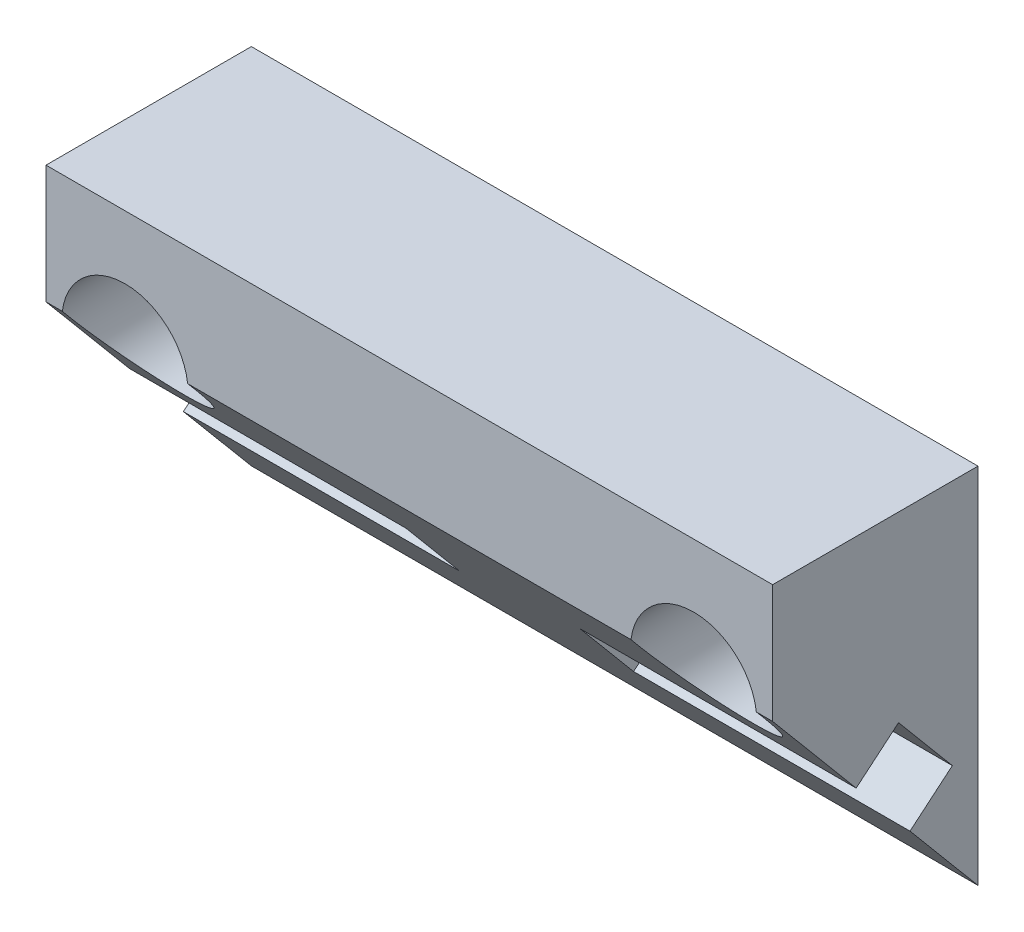
ISO-10303-21;
HEADER;
FILE_DESCRIPTION(('STEP AP214'),'2;1');
FILE_NAME('part.step','',(''),(''),'','','');
FILE_SCHEMA(('AUTOMOTIVE_DESIGN { 1 0 10303 214 1 1 1 1 }'));
ENDSEC;
DATA;
#1=APPLICATION_CONTEXT('core data for automotive mechanical design processes');
#2=APPLICATION_PROTOCOL_DEFINITION('international standard','automotive_design',2000,#1);
#3=PRODUCT_CONTEXT('',#1,'mechanical');
#4=PRODUCT('Part','Part','',(#3));
#5=PRODUCT_RELATED_PRODUCT_CATEGORY('part','',(#4));
#6=PRODUCT_DEFINITION_FORMATION('','',#4);
#7=PRODUCT_DEFINITION_CONTEXT('part definition',#1,'design');
#8=PRODUCT_DEFINITION('design','',#6,#7);
#9=PRODUCT_DEFINITION_SHAPE('','',#8);
#10=(LENGTH_UNIT() NAMED_UNIT(*) SI_UNIT(.MILLI.,.METRE.));
#11=(NAMED_UNIT(*) PLANE_ANGLE_UNIT() SI_UNIT($,.RADIAN.));
#12=(NAMED_UNIT(*) SI_UNIT($,.STERADIAN.) SOLID_ANGLE_UNIT());
#13=UNCERTAINTY_MEASURE_WITH_UNIT(LENGTH_MEASURE(1.E-05),#10,'distance_accuracy_value','');
#14=(GEOMETRIC_REPRESENTATION_CONTEXT(3) GLOBAL_UNCERTAINTY_ASSIGNED_CONTEXT((#13)) GLOBAL_UNIT_ASSIGNED_CONTEXT((#10,
#11,#12)) REPRESENTATION_CONTEXT('',''));
#15=CARTESIAN_POINT('',(0.,0.,0.));
#16=DIRECTION('',(0.,0.,1.));
#17=DIRECTION('',(1.,0.,0.));
#18=AXIS2_PLACEMENT_3D('',#15,#16,#17);
#19=CARTESIAN_POINT('',(23.,-14.9891467909166,0.));
#20=DIRECTION('',(0.,0.642787609686539,-0.766044443118978));
#21=DIRECTION('',(0.,0.766044443118978,0.642787609686539));
#22=AXIS2_PLACEMENT_3D('',#19,#20,#21);
#23=PLANE('',#22);
#24=DIRECTION('',(0.,-0.766044443118978,-0.642787609686539));
#25=VECTOR('',#24,1.);
#26=CARTESIAN_POINT('',(-23.,-14.9891467909166,0.));
#27=LINE('',#26,#25);
#28=CARTESIAN_POINT('',(-23.,0.503649912808122,13.));
#29=VERTEX_POINT('',#28);
#30=CARTESIAN_POINT('',(-23.,-5.79873444054971,7.71167161355999));
#31=VERTEX_POINT('',#30);
#32=EDGE_CURVE('E233',#29,#31,#27,.T.);
#33=ORIENTED_EDGE('',*,*,#32,.T.);
#34=DIRECTION('',(1.,0.,0.));
#35=VECTOR('',#34,1.);
#36=CARTESIAN_POINT('',(-23.,-5.79873444054971,7.71167161355999));
#37=LINE('',#36,#35);
#38=CARTESIAN_POINT('',(-5.5,-5.79873444054971,7.71167161355999));
#39=VERTEX_POINT('',#38);
#40=EDGE_CURVE('E180',#31,#39,#37,.T.);
#41=ORIENTED_EDGE('',*,*,#40,.T.);
#42=DIRECTION('',(0.,-0.766044443118978,-0.642787609686539));
#43=VECTOR('',#42,1.);
#44=CARTESIAN_POINT('',(-5.5,-9.85876998908029,4.30489728222133));
#45=LINE('',#44,#43);
#46=CARTESIAN_POINT('',(-5.5,-9.85876998908029,4.30489728222133));
#47=VERTEX_POINT('',#46);
#48=EDGE_CURVE('E161',#39,#47,#45,.T.);
#49=ORIENTED_EDGE('',*,*,#48,.T.);
#50=DIRECTION('',(1.,0.,0.));
#51=VECTOR('',#50,1.);
#52=CARTESIAN_POINT('',(-23.,-9.85876998908029,4.30489728222133));
#53=LINE('',#52,#51);
#54=CARTESIAN_POINT('',(-23.,-9.85876998908029,4.30489728222133));
#55=VERTEX_POINT('',#54);
#56=EDGE_CURVE('E172',#55,#47,#53,.T.);
#57=ORIENTED_EDGE('',*,*,#56,.F.);
#58=CARTESIAN_POINT('',(-23.,-14.9891467909166,0.));
#59=VERTEX_POINT('',#58);
#60=EDGE_CURVE('E162',#55,#59,#27,.T.);
#61=ORIENTED_EDGE('',*,*,#60,.T.);
#62=DIRECTION('',(-1.,0.,0.));
#63=VECTOR('',#62,1.);
#64=CARTESIAN_POINT('',(23.,-14.9891467909166,0.));
#65=LINE('',#64,#63);
#66=CARTESIAN_POINT('',(23.,-14.9891467909166,0.));
#67=VERTEX_POINT('',#66);
#68=EDGE_CURVE('E237',#67,#59,#65,.T.);
#69=ORIENTED_EDGE('',*,*,#68,.F.);
#70=DIRECTION('',(0.,-0.766044443118978,-0.642787609686539));
#71=VECTOR('',#70,1.);
#72=CARTESIAN_POINT('',(23.,-14.9891467909166,0.));
#73=LINE('',#72,#71);
#74=CARTESIAN_POINT('',(23.,-9.85876998908029,4.30489728222133));
#75=VERTEX_POINT('',#74);
#76=EDGE_CURVE('E232',#75,#67,#73,.T.);
#77=ORIENTED_EDGE('',*,*,#76,.F.);
#78=DIRECTION('',(-1.,0.,0.));
#79=VECTOR('',#78,1.);
#80=CARTESIAN_POINT('',(23.,-9.85876998908029,4.30489728222133));
#81=LINE('',#80,#79);
#82=CARTESIAN_POINT('',(5.5,-9.85876998908029,4.30489728222133));
#83=VERTEX_POINT('',#82);
#84=EDGE_CURVE('E189',#75,#83,#81,.T.);
#85=ORIENTED_EDGE('',*,*,#84,.T.);
#86=DIRECTION('',(0.,-0.766044443118978,-0.642787609686539));
#87=VECTOR('',#86,1.);
#88=CARTESIAN_POINT('',(5.5,-9.85876998908029,4.30489728222133));
#89=LINE('',#88,#87);
#90=CARTESIAN_POINT('',(5.5,-5.79873444054971,7.71167161355999));
#91=VERTEX_POINT('',#90);
#92=EDGE_CURVE('E183',#91,#83,#89,.T.);
#93=ORIENTED_EDGE('',*,*,#92,.F.);
#94=DIRECTION('',(-1.,0.,0.));
#95=VECTOR('',#94,1.);
#96=CARTESIAN_POINT('',(23.,-5.79873444054971,7.71167161355999));
#97=LINE('',#96,#95);
#98=CARTESIAN_POINT('',(23.,-5.79873444054971,7.71167161355999));
#99=VERTEX_POINT('',#98);
#100=EDGE_CURVE('E196',#99,#91,#97,.T.);
#101=ORIENTED_EDGE('',*,*,#100,.F.);
#102=CARTESIAN_POINT('',(23.,0.503649912808122,13.));
#103=VERTEX_POINT('',#102);
#104=EDGE_CURVE('E236',#103,#99,#73,.T.);
#105=ORIENTED_EDGE('',*,*,#104,.F.);
#106=DIRECTION('',(-1.,0.,0.));
#107=VECTOR('',#106,1.);
#108=CARTESIAN_POINT('',(23.,0.503649912808122,13.));
#109=LINE('',#108,#107);
#110=CARTESIAN_POINT('',(21.9681654155703,0.503649912808122,13.));
#111=VERTEX_POINT('',#110);
#112=EDGE_CURVE('E255',#103,#111,#109,.T.);
#113=ORIENTED_EDGE('',*,*,#112,.T.);
#114=CARTESIAN_POINT('',(18.,0.,12.5773875439202));
#115=DIRECTION('',(0.,0.642787609686539,-0.766044443118978));
#116=DIRECTION('',(0.,-0.766044443118978,-0.642787609686539));
#117=AXIS2_PLACEMENT_3D('',#114,#115,#116);
#118=ELLIPSE('',#117,5.22162915732911,4.);
#119=CARTESIAN_POINT('',(14.0318345844297,0.503649912808122,13.));
#120=VERTEX_POINT('',#119);
#121=EDGE_CURVE('E216',#120,#111,#118,.F.);
#122=ORIENTED_EDGE('',*,*,#121,.F.);
#123=CARTESIAN_POINT('',(-14.0318345844297,0.503649912808122,13.));
#124=VERTEX_POINT('',#123);
#125=EDGE_CURVE('E253',#120,#124,#109,.T.);
#126=ORIENTED_EDGE('',*,*,#125,.T.);
#127=CARTESIAN_POINT('',(-18.,0.,12.5773875439202));
#128=DIRECTION('',(0.,0.642787609686539,-0.766044443118978));
#129=DIRECTION('',(0.,-0.766044443118978,-0.642787609686539));
#130=AXIS2_PLACEMENT_3D('',#127,#128,#129);
#131=ELLIPSE('',#130,5.22162915732911,4.);
#132=CARTESIAN_POINT('',(-21.9681654155703,0.503649912808122,13.));
#133=VERTEX_POINT('',#132);
#134=EDGE_CURVE('E218',#133,#124,#131,.F.);
#135=ORIENTED_EDGE('',*,*,#134,.F.);
#136=EDGE_CURVE('E252',#133,#29,#109,.T.);
#137=ORIENTED_EDGE('',*,*,#136,.T.);
#138=EDGE_LOOP('',(#33,#41,#49,#57,#61,#69,#77,#85,#93,#101,#105,#113,#122,#126,#135,#137));
#139=FACE_BOUND('',#138,.T.);
#140=ADVANCED_FACE('F39',(#139),#23,.F.);
#141=CARTESIAN_POINT('',(-18.,0.,13.));
#142=DIRECTION('',(0.,0.,-1.));
#143=DIRECTION('',(-1.,0.,0.));
#144=AXIS2_PLACEMENT_3D('',#141,#142,#143);
#145=CYLINDRICAL_SURFACE('',#144,2.25);
#146=CARTESIAN_POINT('',(-18.,0.,0.));
#147=DIRECTION('',(0.,0.,1.));
#148=DIRECTION('',(1.,0.,0.));
#149=AXIS2_PLACEMENT_3D('',#146,#147,#148);
#150=CIRCLE('',#149,2.25);
#151=CARTESIAN_POINT('',(-15.75,0.,0.));
#152=VERTEX_POINT('',#151);
#153=EDGE_CURVE('E219',#152,#152,#150,.T.);
#154=ORIENTED_EDGE('',*,*,#153,.F.);
#155=EDGE_LOOP('',(#154));
#156=FACE_BOUND('',#155,.T.);
#157=CARTESIAN_POINT('',(-18.,0.,6.));
#158=DIRECTION('',(0.,0.,1.));
#159=DIRECTION('',(1.,0.,0.));
#160=AXIS2_PLACEMENT_3D('',#157,#158,#159);
#161=CIRCLE('',#160,2.25);
#162=CARTESIAN_POINT('',(-15.75,0.,6.));
#163=VERTEX_POINT('',#162);
#164=EDGE_CURVE('E43',#163,#163,#161,.T.);
#165=ORIENTED_EDGE('',*,*,#164,.T.);
#166=EDGE_LOOP('',(#165));
#167=FACE_BOUND('',#166,.T.);
#168=ADVANCED_FACE('F261',(#156,#167),#145,.F.);
#169=CARTESIAN_POINT('',(18.,0.,13.));
#170=DIRECTION('',(0.,0.,-1.));
#171=DIRECTION('',(-1.,0.,0.));
#172=AXIS2_PLACEMENT_3D('',#169,#170,#171);
#173=CYLINDRICAL_SURFACE('',#172,2.25);
#174=CARTESIAN_POINT('',(18.,0.,0.));
#175=DIRECTION('',(0.,0.,1.));
#176=DIRECTION('',(1.,0.,0.));
#177=AXIS2_PLACEMENT_3D('',#174,#175,#176);
#178=CIRCLE('',#177,2.25);
#179=CARTESIAN_POINT('',(20.25,0.,0.));
#180=VERTEX_POINT('',#179);
#181=EDGE_CURVE('E221',#180,#180,#178,.T.);
#182=ORIENTED_EDGE('',*,*,#181,.F.);
#183=EDGE_LOOP('',(#182));
#184=FACE_BOUND('',#183,.T.);
#185=CARTESIAN_POINT('',(18.,0.,6.));
#186=DIRECTION('',(0.,0.,1.));
#187=DIRECTION('',(1.,0.,0.));
#188=AXIS2_PLACEMENT_3D('',#185,#186,#187);
#189=CIRCLE('',#188,2.25);
#190=CARTESIAN_POINT('',(20.25,0.,6.));
#191=VERTEX_POINT('',#190);
#192=EDGE_CURVE('E206',#191,#191,#189,.T.);
#193=ORIENTED_EDGE('',*,*,#192,.T.);
#194=EDGE_LOOP('',(#193));
#195=FACE_BOUND('',#194,.T.);
#196=ADVANCED_FACE('F318',(#184,#195),#173,.F.);
#197=CARTESIAN_POINT('',(23.,8.,0.));
#198=DIRECTION('',(0.,0.,1.));
#199=DIRECTION('',(1.,0.,0.));
#200=AXIS2_PLACEMENT_3D('',#197,#198,#199);
#201=PLANE('',#200);
#202=ORIENTED_EDGE('',*,*,#181,.T.);
#203=EDGE_LOOP('',(#202));
#204=FACE_BOUND('',#203,.T.);
#205=ORIENTED_EDGE('',*,*,#153,.T.);
#206=EDGE_LOOP('',(#205));
#207=FACE_BOUND('',#206,.T.);
#208=DIRECTION('',(0.,1.,0.));
#209=VECTOR('',#208,1.);
#210=CARTESIAN_POINT('',(-23.,8.,0.));
#211=LINE('',#210,#209);
#212=CARTESIAN_POINT('',(-23.,8.,0.));
#213=VERTEX_POINT('',#212);
#214=EDGE_CURVE('E222',#59,#213,#211,.T.);
#215=ORIENTED_EDGE('',*,*,#214,.T.);
#216=DIRECTION('',(-1.,0.,0.));
#217=VECTOR('',#216,1.);
#218=CARTESIAN_POINT('',(23.,8.,0.));
#219=LINE('',#218,#217);
#220=CARTESIAN_POINT('',(23.,8.,0.));
#221=VERTEX_POINT('',#220);
#222=EDGE_CURVE('E11',#221,#213,#219,.T.);
#223=ORIENTED_EDGE('',*,*,#222,.F.);
#224=DIRECTION('',(0.,1.,0.));
#225=VECTOR('',#224,1.);
#226=CARTESIAN_POINT('',(23.,8.,0.));
#227=LINE('',#226,#225);
#228=EDGE_CURVE('E227',#67,#221,#227,.T.);
#229=ORIENTED_EDGE('',*,*,#228,.F.);
#230=ORIENTED_EDGE('',*,*,#68,.T.);
#231=EDGE_LOOP('',(#215,#223,#229,#230));
#232=FACE_BOUND('',#231,.T.);
#233=ADVANCED_FACE('F41',(#204,#207,#232),#201,.F.);
#234=CARTESIAN_POINT('',(23.,8.,13.));
#235=DIRECTION('',(0.,-1.,0.));
#236=DIRECTION('',(0.,0.,-1.));
#237=AXIS2_PLACEMENT_3D('',#234,#235,#236);
#238=PLANE('',#237);
#239=DIRECTION('',(0.,0.,1.));
#240=VECTOR('',#239,1.);
#241=CARTESIAN_POINT('',(-23.,8.,13.));
#242=LINE('',#241,#240);
#243=CARTESIAN_POINT('',(-23.,8.,13.));
#244=VERTEX_POINT('',#243);
#245=EDGE_CURVE('E245',#213,#244,#242,.T.);
#246=ORIENTED_EDGE('',*,*,#245,.T.);
#247=DIRECTION('',(-1.,0.,0.));
#248=VECTOR('',#247,1.);
#249=CARTESIAN_POINT('',(23.,8.,13.));
#250=LINE('',#249,#248);
#251=CARTESIAN_POINT('',(23.,8.,13.));
#252=VERTEX_POINT('',#251);
#253=EDGE_CURVE('E48',#252,#244,#250,.T.);
#254=ORIENTED_EDGE('',*,*,#253,.F.);
#255=DIRECTION('',(0.,0.,1.));
#256=VECTOR('',#255,1.);
#257=CARTESIAN_POINT('',(23.,8.,13.));
#258=LINE('',#257,#256);
#259=EDGE_CURVE('E229',#221,#252,#258,.T.);
#260=ORIENTED_EDGE('',*,*,#259,.F.);
#261=ORIENTED_EDGE('',*,*,#222,.T.);
#262=EDGE_LOOP('',(#246,#254,#260,#261));
#263=FACE_BOUND('',#262,.T.);
#264=ADVANCED_FACE('F291',(#263),#238,.F.);
#265=CARTESIAN_POINT('',(23.,0.503649912808122,13.));
#266=DIRECTION('',(0.,0.,-1.));
#267=DIRECTION('',(-1.,0.,0.));
#268=AXIS2_PLACEMENT_3D('',#265,#266,#267);
#269=PLANE('',#268);
#270=CARTESIAN_POINT('',(18.,0.,13.));
#271=DIRECTION('',(0.,0.,1.));
#272=DIRECTION('',(1.,0.,0.));
#273=AXIS2_PLACEMENT_3D('',#270,#271,#272);
#274=CIRCLE('',#273,4.);
#275=EDGE_CURVE('E207',#111,#120,#274,.T.);
#276=ORIENTED_EDGE('',*,*,#275,.F.);
#277=ORIENTED_EDGE('',*,*,#112,.F.);
#278=DIRECTION('',(0.,-1.,0.));
#279=VECTOR('',#278,1.);
#280=CARTESIAN_POINT('',(23.,0.503649912808122,13.));
#281=LINE('',#280,#279);
#282=EDGE_CURVE('E231',#252,#103,#281,.T.);
#283=ORIENTED_EDGE('',*,*,#282,.F.);
#284=ORIENTED_EDGE('',*,*,#253,.T.);
#285=DIRECTION('',(0.,-1.,0.));
#286=VECTOR('',#285,1.);
#287=CARTESIAN_POINT('',(-23.,0.503649912808122,13.));
#288=LINE('',#287,#286);
#289=EDGE_CURVE('E242',#244,#29,#288,.T.);
#290=ORIENTED_EDGE('',*,*,#289,.T.);
#291=ORIENTED_EDGE('',*,*,#136,.F.);
#292=CARTESIAN_POINT('',(-18.,0.,13.));
#293=DIRECTION('',(0.,0.,1.));
#294=DIRECTION('',(1.,0.,0.));
#295=AXIS2_PLACEMENT_3D('',#292,#293,#294);
#296=CIRCLE('',#295,4.);
#297=EDGE_CURVE('E204',#124,#133,#296,.T.);
#298=ORIENTED_EDGE('',*,*,#297,.F.);
#299=ORIENTED_EDGE('',*,*,#125,.F.);
#300=EDGE_LOOP('',(#276,#277,#283,#284,#290,#291,#298,#299));
#301=FACE_BOUND('',#300,.T.);
#302=ADVANCED_FACE('F284',(#301),#269,.F.);
#303=CARTESIAN_POINT('',(23.,0.,0.));
#304=DIRECTION('',(1.,0.,0.));
#305=DIRECTION('',(0.,0.,-1.));
#306=AXIS2_PLACEMENT_3D('',#303,#304,#305);
#307=PLANE('',#306);
#308=DIRECTION('',(0.,0.642787609686539,-0.766044443118978));
#309=VECTOR('',#308,1.);
#310=CARTESIAN_POINT('',(23.,-7.6090133551774,1.62374173130491));
#311=LINE('',#310,#309);
#312=CARTESIAN_POINT('',(23.,-7.6090133551774,1.6237417313049));
#313=VERTEX_POINT('',#312);
#314=EDGE_CURVE('E181',#75,#313,#311,.T.);
#315=ORIENTED_EDGE('',*,*,#314,.F.);
#316=ORIENTED_EDGE('',*,*,#76,.T.);
#317=ORIENTED_EDGE('',*,*,#228,.T.);
#318=ORIENTED_EDGE('',*,*,#259,.T.);
#319=ORIENTED_EDGE('',*,*,#282,.T.);
#320=ORIENTED_EDGE('',*,*,#104,.T.);
#321=DIRECTION('',(0.,-0.642787609686539,0.766044443118978));
#322=VECTOR('',#321,1.);
#323=CARTESIAN_POINT('',(23.,-5.79873444054971,7.71167161355999));
#324=LINE('',#323,#322);
#325=CARTESIAN_POINT('',(23.,-3.54897780664682,5.03051606264356));
#326=VERTEX_POINT('',#325);
#327=EDGE_CURVE('E187',#326,#99,#324,.T.);
#328=ORIENTED_EDGE('',*,*,#327,.F.);
#329=DIRECTION('',(0.,0.766044443118978,0.642787609686539));
#330=VECTOR('',#329,1.);
#331=CARTESIAN_POINT('',(23.,-3.54897780664682,5.03051606264356));
#332=LINE('',#331,#330);
#333=EDGE_CURVE('E182',#313,#326,#332,.T.);
#334=ORIENTED_EDGE('',*,*,#333,.F.);
#335=EDGE_LOOP('',(#315,#316,#317,#318,#319,#320,#328,#334));
#336=FACE_BOUND('',#335,.T.);
#337=ADVANCED_FACE('F330',(#336),#307,.T.);
#338=CARTESIAN_POINT('',(-23.,0.,0.));
#339=DIRECTION('',(1.,0.,0.));
#340=DIRECTION('',(0.,0.,-1.));
#341=AXIS2_PLACEMENT_3D('',#338,#339,#340);
#342=PLANE('',#341);
#343=ORIENTED_EDGE('',*,*,#60,.F.);
#344=DIRECTION('',(0.,0.642787609686539,-0.766044443118978));
#345=VECTOR('',#344,1.);
#346=CARTESIAN_POINT('',(-23.,-7.6090133551774,1.62374173130491));
#347=LINE('',#346,#345);
#348=CARTESIAN_POINT('',(-23.,-7.6090133551774,1.62374173130491));
#349=VERTEX_POINT('',#348);
#350=EDGE_CURVE('E143',#55,#349,#347,.T.);
#351=ORIENTED_EDGE('',*,*,#350,.T.);
#352=DIRECTION('',(0.,0.766044443118978,0.642787609686539));
#353=VECTOR('',#352,1.);
#354=CARTESIAN_POINT('',(-23.,-3.54897780664682,5.03051606264356));
#355=LINE('',#354,#353);
#356=CARTESIAN_POINT('',(-23.,-3.54897780664682,5.03051606264356));
#357=VERTEX_POINT('',#356);
#358=EDGE_CURVE('E154',#349,#357,#355,.T.);
#359=ORIENTED_EDGE('',*,*,#358,.T.);
#360=DIRECTION('',(0.,-0.642787609686539,0.766044443118978));
#361=VECTOR('',#360,1.);
#362=CARTESIAN_POINT('',(-23.,-5.79873444054971,7.71167161355999));
#363=LINE('',#362,#361);
#364=EDGE_CURVE('E57',#357,#31,#363,.T.);
#365=ORIENTED_EDGE('',*,*,#364,.T.);
#366=ORIENTED_EDGE('',*,*,#32,.F.);
#367=ORIENTED_EDGE('',*,*,#289,.F.);
#368=ORIENTED_EDGE('',*,*,#245,.F.);
#369=ORIENTED_EDGE('',*,*,#214,.F.);
#370=EDGE_LOOP('',(#343,#351,#359,#365,#366,#367,#368,#369));
#371=FACE_BOUND('',#370,.T.);
#372=ADVANCED_FACE('F159',(#371),#342,.F.);
#373=CARTESIAN_POINT('',(18.,0.,13.));
#374=DIRECTION('',(0.,0.,-1.));
#375=DIRECTION('',(-1.,0.,0.));
#376=AXIS2_PLACEMENT_3D('',#373,#374,#375);
#377=CYLINDRICAL_SURFACE('',#376,4.);
#378=CARTESIAN_POINT('',(18.,0.,6.));
#379=DIRECTION('',(0.,0.,1.));
#380=DIRECTION('',(1.,0.,0.));
#381=AXIS2_PLACEMENT_3D('',#378,#379,#380);
#382=CIRCLE('',#381,4.);
#383=CARTESIAN_POINT('',(22.,0.,6.));
#384=VERTEX_POINT('',#383);
#385=EDGE_CURVE('E209',#384,#384,#382,.T.);
#386=ORIENTED_EDGE('',*,*,#385,.F.);
#387=EDGE_LOOP('',(#386));
#388=FACE_BOUND('',#387,.T.);
#389=ORIENTED_EDGE('',*,*,#121,.T.);
#390=ORIENTED_EDGE('',*,*,#275,.T.);
#391=EDGE_LOOP('',(#389,#390));
#392=FACE_BOUND('',#391,.T.);
#393=ADVANCED_FACE('F346',(#388,#392),#377,.F.);
#394=CARTESIAN_POINT('',(18.,0.,6.));
#395=DIRECTION('',(0.,0.,1.));
#396=DIRECTION('',(1.,0.,0.));
#397=AXIS2_PLACEMENT_3D('',#394,#395,#396);
#398=PLANE('',#397);
#399=ORIENTED_EDGE('',*,*,#192,.F.);
#400=EDGE_LOOP('',(#399));
#401=FACE_BOUND('',#400,.T.);
#402=ORIENTED_EDGE('',*,*,#385,.T.);
#403=EDGE_LOOP('',(#402));
#404=FACE_BOUND('',#403,.T.);
#405=ADVANCED_FACE('F273',(#401,#404),#398,.T.);
#406=CARTESIAN_POINT('',(-18.,0.,13.));
#407=DIRECTION('',(0.,0.,-1.));
#408=DIRECTION('',(-1.,0.,0.));
#409=AXIS2_PLACEMENT_3D('',#406,#407,#408);
#410=CYLINDRICAL_SURFACE('',#409,4.);
#411=CARTESIAN_POINT('',(-18.,0.,6.));
#412=DIRECTION('',(0.,0.,1.));
#413=DIRECTION('',(1.,0.,0.));
#414=AXIS2_PLACEMENT_3D('',#411,#412,#413);
#415=CIRCLE('',#414,4.);
#416=CARTESIAN_POINT('',(-14.,0.,6.));
#417=VERTEX_POINT('',#416);
#418=EDGE_CURVE('E215',#417,#417,#415,.T.);
#419=ORIENTED_EDGE('',*,*,#418,.F.);
#420=EDGE_LOOP('',(#419));
#421=FACE_BOUND('',#420,.T.);
#422=ORIENTED_EDGE('',*,*,#134,.T.);
#423=ORIENTED_EDGE('',*,*,#297,.T.);
#424=EDGE_LOOP('',(#422,#423));
#425=FACE_BOUND('',#424,.T.);
#426=ADVANCED_FACE('F267',(#421,#425),#410,.F.);
#427=CARTESIAN_POINT('',(-18.,0.,6.));
#428=DIRECTION('',(0.,0.,1.));
#429=DIRECTION('',(1.,0.,0.));
#430=AXIS2_PLACEMENT_3D('',#427,#428,#429);
#431=PLANE('',#430);
#432=ORIENTED_EDGE('',*,*,#164,.F.);
#433=EDGE_LOOP('',(#432));
#434=FACE_BOUND('',#433,.T.);
#435=ORIENTED_EDGE('',*,*,#418,.T.);
#436=EDGE_LOOP('',(#435));
#437=FACE_BOUND('',#436,.T.);
#438=ADVANCED_FACE('F264',(#434,#437),#431,.T.);
#439=CARTESIAN_POINT('',(23.,-7.6090133551774,1.62374173130491));
#440=DIRECTION('',(0.,0.766044443118978,0.642787609686539));
#441=DIRECTION('',(0.,-0.642787609686539,0.766044443118978));
#442=AXIS2_PLACEMENT_3D('',#439,#440,#441);
#443=PLANE('',#442);
#444=DIRECTION('',(0.,0.642787609686539,-0.766044443118978));
#445=VECTOR('',#444,1.);
#446=CARTESIAN_POINT('',(5.5,-7.6090133551774,1.62374173130491));
#447=LINE('',#446,#445);
#448=CARTESIAN_POINT('',(5.5,-7.6090133551774,1.62374173130491));
#449=VERTEX_POINT('',#448);
#450=EDGE_CURVE('E176',#83,#449,#447,.T.);
#451=ORIENTED_EDGE('',*,*,#450,.F.);
#452=ORIENTED_EDGE('',*,*,#84,.F.);
#453=ORIENTED_EDGE('',*,*,#314,.T.);
#454=DIRECTION('',(-1.,0.,0.));
#455=VECTOR('',#454,1.);
#456=CARTESIAN_POINT('',(23.,-7.6090133551774,1.62374173130491));
#457=LINE('',#456,#455);
#458=EDGE_CURVE('E61',#313,#449,#457,.T.);
#459=ORIENTED_EDGE('',*,*,#458,.T.);
#460=EDGE_LOOP('',(#451,#452,#453,#459));
#461=FACE_BOUND('',#460,.T.);
#462=ADVANCED_FACE('F268',(#461),#443,.T.);
#463=CARTESIAN_POINT('',(23.,-3.54897780664682,5.03051606264356));
#464=DIRECTION('',(0.,-0.642787609686539,0.766044443118978));
#465=DIRECTION('',(0.,-0.766044443118978,-0.642787609686539));
#466=AXIS2_PLACEMENT_3D('',#463,#464,#465);
#467=PLANE('',#466);
#468=DIRECTION('',(0.,0.766044443118978,0.642787609686539));
#469=VECTOR('',#468,1.);
#470=CARTESIAN_POINT('',(5.5,-3.54897780664682,5.03051606264356));
#471=LINE('',#470,#469);
#472=CARTESIAN_POINT('',(5.5,-3.54897780664682,5.03051606264356));
#473=VERTEX_POINT('',#472);
#474=EDGE_CURVE('E192',#449,#473,#471,.T.);
#475=ORIENTED_EDGE('',*,*,#474,.F.);
#476=ORIENTED_EDGE('',*,*,#458,.F.);
#477=ORIENTED_EDGE('',*,*,#333,.T.);
#478=DIRECTION('',(-1.,0.,0.));
#479=VECTOR('',#478,1.);
#480=CARTESIAN_POINT('',(23.,-3.54897780664682,5.03051606264356));
#481=LINE('',#480,#479);
#482=EDGE_CURVE('E201',#326,#473,#481,.T.);
#483=ORIENTED_EDGE('',*,*,#482,.T.);
#484=EDGE_LOOP('',(#475,#476,#477,#483));
#485=FACE_BOUND('',#484,.T.);
#486=ADVANCED_FACE('F374',(#485),#467,.T.);
#487=CARTESIAN_POINT('',(23.,-5.79873444054971,7.71167161355999));
#488=DIRECTION('',(0.,-0.766044443118978,-0.642787609686539));
#489=DIRECTION('',(0.,0.642787609686539,-0.766044443118978));
#490=AXIS2_PLACEMENT_3D('',#487,#488,#489);
#491=PLANE('',#490);
#492=DIRECTION('',(0.,-0.642787609686539,0.766044443118978));
#493=VECTOR('',#492,1.);
#494=CARTESIAN_POINT('',(5.5,-5.79873444054971,7.71167161355999));
#495=LINE('',#494,#493);
#496=EDGE_CURVE('E194',#473,#91,#495,.T.);
#497=ORIENTED_EDGE('',*,*,#496,.F.);
#498=ORIENTED_EDGE('',*,*,#482,.F.);
#499=ORIENTED_EDGE('',*,*,#327,.T.);
#500=ORIENTED_EDGE('',*,*,#100,.T.);
#501=EDGE_LOOP('',(#497,#498,#499,#500));
#502=FACE_BOUND('',#501,.T.);
#503=ADVANCED_FACE('F363',(#502),#491,.T.);
#504=CARTESIAN_POINT('',(5.5,0.,0.));
#505=DIRECTION('',(-1.,0.,0.));
#506=DIRECTION('',(0.,0.,1.));
#507=AXIS2_PLACEMENT_3D('',#504,#505,#506);
#508=PLANE('',#507);
#509=ORIENTED_EDGE('',*,*,#450,.T.);
#510=ORIENTED_EDGE('',*,*,#474,.T.);
#511=ORIENTED_EDGE('',*,*,#496,.T.);
#512=ORIENTED_EDGE('',*,*,#92,.T.);
#513=EDGE_LOOP('',(#509,#510,#511,#512));
#514=FACE_BOUND('',#513,.T.);
#515=ADVANCED_FACE('F309',(#514),#508,.F.);
#516=CARTESIAN_POINT('',(-23.,-7.6090133551774,1.62374173130491));
#517=DIRECTION('',(0.,-0.766044443118978,-0.642787609686539));
#518=DIRECTION('',(0.,0.642787609686539,-0.766044443118978));
#519=AXIS2_PLACEMENT_3D('',#516,#517,#518);
#520=PLANE('',#519);
#521=DIRECTION('',(0.,0.642787609686539,-0.766044443118978));
#522=VECTOR('',#521,1.);
#523=CARTESIAN_POINT('',(-5.5,-7.6090133551774,1.62374173130491));
#524=LINE('',#523,#522);
#525=CARTESIAN_POINT('',(-5.5,-7.6090133551774,1.62374173130491));
#526=VERTEX_POINT('',#525);
#527=EDGE_CURVE('E149',#47,#526,#524,.T.);
#528=ORIENTED_EDGE('',*,*,#527,.T.);
#529=DIRECTION('',(1.,0.,0.));
#530=VECTOR('',#529,1.);
#531=CARTESIAN_POINT('',(-23.,-7.6090133551774,1.62374173130491));
#532=LINE('',#531,#530);
#533=EDGE_CURVE('E142',#349,#526,#532,.T.);
#534=ORIENTED_EDGE('',*,*,#533,.F.);
#535=ORIENTED_EDGE('',*,*,#350,.F.);
#536=ORIENTED_EDGE('',*,*,#56,.T.);
#537=EDGE_LOOP('',(#528,#534,#535,#536));
#538=FACE_BOUND('',#537,.T.);
#539=ADVANCED_FACE('F141',(#538),#520,.F.);
#540=CARTESIAN_POINT('',(-23.,-5.79873444054971,7.71167161355999));
#541=DIRECTION('',(0.,0.766044443118978,0.642787609686539));
#542=DIRECTION('',(0.,-0.642787609686539,0.766044443118978));
#543=AXIS2_PLACEMENT_3D('',#540,#541,#542);
#544=PLANE('',#543);
#545=DIRECTION('',(0.,-0.642787609686539,0.766044443118978));
#546=VECTOR('',#545,1.);
#547=CARTESIAN_POINT('',(-5.5,-5.79873444054971,7.71167161355999));
#548=LINE('',#547,#546);
#549=CARTESIAN_POINT('',(-5.5,-3.54897780664682,5.03051606264356));
#550=VERTEX_POINT('',#549);
#551=EDGE_CURVE('E168',#550,#39,#548,.T.);
#552=ORIENTED_EDGE('',*,*,#551,.T.);
#553=ORIENTED_EDGE('',*,*,#40,.F.);
#554=ORIENTED_EDGE('',*,*,#364,.F.);
#555=DIRECTION('',(1.,0.,0.));
#556=VECTOR('',#555,1.);
#557=CARTESIAN_POINT('',(-23.,-3.54897780664682,5.03051606264356));
#558=LINE('',#557,#556);
#559=EDGE_CURVE('E155',#357,#550,#558,.T.);
#560=ORIENTED_EDGE('',*,*,#559,.T.);
#561=EDGE_LOOP('',(#552,#553,#554,#560));
#562=FACE_BOUND('',#561,.T.);
#563=ADVANCED_FACE('F305',(#562),#544,.F.);
#564=CARTESIAN_POINT('',(-23.,-3.54897780664682,5.03051606264356));
#565=DIRECTION('',(0.,0.642787609686539,-0.766044443118978));
#566=DIRECTION('',(0.,0.766044443118978,0.642787609686539));
#567=AXIS2_PLACEMENT_3D('',#564,#565,#566);
#568=PLANE('',#567);
#569=DIRECTION('',(0.,0.766044443118978,0.642787609686539));
#570=VECTOR('',#569,1.);
#571=CARTESIAN_POINT('',(-5.5,-3.54897780664682,5.03051606264356));
#572=LINE('',#571,#570);
#573=EDGE_CURVE('E171',#526,#550,#572,.T.);
#574=ORIENTED_EDGE('',*,*,#573,.T.);
#575=ORIENTED_EDGE('',*,*,#559,.F.);
#576=ORIENTED_EDGE('',*,*,#358,.F.);
#577=ORIENTED_EDGE('',*,*,#533,.T.);
#578=EDGE_LOOP('',(#574,#575,#576,#577));
#579=FACE_BOUND('',#578,.T.);
#580=ADVANCED_FACE('F156',(#579),#568,.F.);
#581=CARTESIAN_POINT('',(-5.5,0.,0.));
#582=DIRECTION('',(-1.,0.,0.));
#583=DIRECTION('',(0.,0.,1.));
#584=AXIS2_PLACEMENT_3D('',#581,#582,#583);
#585=PLANE('',#584);
#586=ORIENTED_EDGE('',*,*,#527,.F.);
#587=ORIENTED_EDGE('',*,*,#48,.F.);
#588=ORIENTED_EDGE('',*,*,#551,.F.);
#589=ORIENTED_EDGE('',*,*,#573,.F.);
#590=EDGE_LOOP('',(#586,#587,#588,#589));
#591=FACE_BOUND('',#590,.T.);
#592=ADVANCED_FACE('F297',(#591),#585,.T.);
#593=CLOSED_SHELL('',(#140,#168,#196,#233,#264,#302,#337,#372,#393,#405,#426,#438,#462,#486,
#503,#515,#539,#563,#580,#592));
#594=MANIFOLD_SOLID_BREP('B2',#593);
#595=ADVANCED_BREP_SHAPE_REPRESENTATION('',(#18,#594),#14);
#596=SHAPE_DEFINITION_REPRESENTATION(#9,#595);
ENDSEC;
END-ISO-10303-21;
